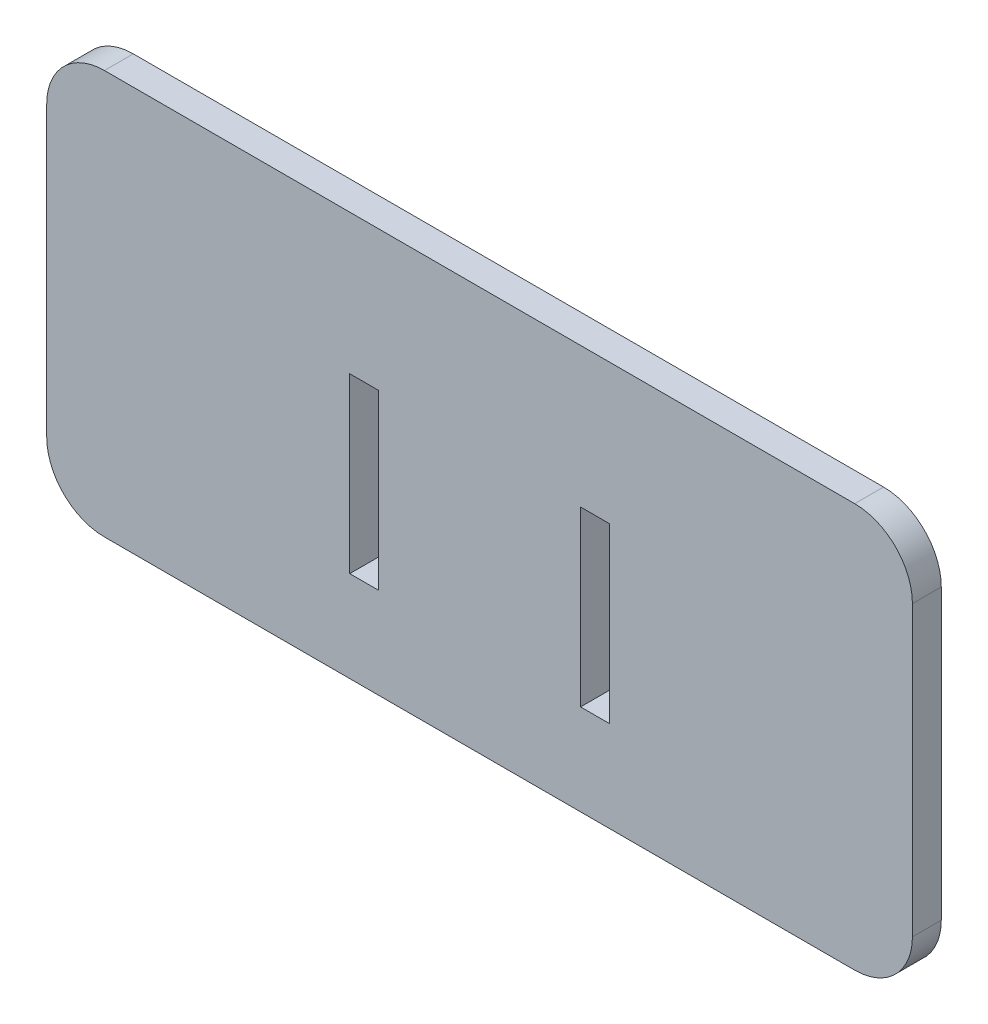
ISO-10303-21;
HEADER;
FILE_DESCRIPTION(('STEP AP214'),'2;1');
FILE_NAME('part.step','',(''),(''),'','','');
FILE_SCHEMA(('AUTOMOTIVE_DESIGN { 1 0 10303 214 1 1 1 1 }'));
ENDSEC;
DATA;
#1=APPLICATION_CONTEXT('core data for automotive mechanical design processes');
#2=APPLICATION_PROTOCOL_DEFINITION('international standard','automotive_design',2000,#1);
#3=PRODUCT_CONTEXT('',#1,'mechanical');
#4=PRODUCT('Part','Part','',(#3));
#5=PRODUCT_RELATED_PRODUCT_CATEGORY('part','',(#4));
#6=PRODUCT_DEFINITION_FORMATION('','',#4);
#7=PRODUCT_DEFINITION_CONTEXT('part definition',#1,'design');
#8=PRODUCT_DEFINITION('design','',#6,#7);
#9=PRODUCT_DEFINITION_SHAPE('','',#8);
#10=(LENGTH_UNIT() NAMED_UNIT(*) SI_UNIT(.MILLI.,.METRE.));
#11=(NAMED_UNIT(*) PLANE_ANGLE_UNIT() SI_UNIT($,.RADIAN.));
#12=(NAMED_UNIT(*) SI_UNIT($,.STERADIAN.) SOLID_ANGLE_UNIT());
#13=UNCERTAINTY_MEASURE_WITH_UNIT(LENGTH_MEASURE(1.E-05),#10,'distance_accuracy_value','');
#14=(GEOMETRIC_REPRESENTATION_CONTEXT(3) GLOBAL_UNCERTAINTY_ASSIGNED_CONTEXT((#13)) GLOBAL_UNIT_ASSIGNED_CONTEXT((#10,
#11,#12)) REPRESENTATION_CONTEXT('',''));
#15=CARTESIAN_POINT('',(0.,0.,0.));
#16=DIRECTION('',(0.,0.,1.));
#17=DIRECTION('',(1.,0.,0.));
#18=AXIS2_PLACEMENT_3D('',#15,#16,#17);
#19=CARTESIAN_POINT('',(80.,20.0000000000001,10.));
#20=DIRECTION('',(0.,0.,-1.));
#21=DIRECTION('',(-1.,0.,0.));
#22=AXIS2_PLACEMENT_3D('',#19,#20,#21);
#23=CYLINDRICAL_SURFACE('',#22,20.);
#24=CARTESIAN_POINT('',(80.,20.0000000000001,0.));
#25=DIRECTION('',(0.,0.,1.));
#26=DIRECTION('',(-1.,0.,0.));
#27=AXIS2_PLACEMENT_3D('',#24,#25,#26);
#28=CIRCLE('',#27,20.);
#29=CARTESIAN_POINT('',(100.,20.0000000000001,0.));
#30=VERTEX_POINT('',#29);
#31=CARTESIAN_POINT('',(80.,40.,0.));
#32=VERTEX_POINT('',#31);
#33=EDGE_CURVE('E199',#30,#32,#28,.T.);
#34=ORIENTED_EDGE('',*,*,#33,.T.);
#35=DIRECTION('',(0.,0.,-1.));
#36=VECTOR('',#35,1.);
#37=CARTESIAN_POINT('',(80.,40.,10.));
#38=LINE('',#37,#36);
#39=CARTESIAN_POINT('',(80.,40.,10.));
#40=VERTEX_POINT('',#39);
#41=EDGE_CURVE('E11',#40,#32,#38,.T.);
#42=ORIENTED_EDGE('',*,*,#41,.F.);
#43=CARTESIAN_POINT('',(80.,20.0000000000001,10.));
#44=DIRECTION('',(0.,0.,1.));
#45=DIRECTION('',(-1.,0.,0.));
#46=AXIS2_PLACEMENT_3D('',#43,#44,#45);
#47=CIRCLE('',#46,20.);
#48=CARTESIAN_POINT('',(100.,20.0000000000001,10.));
#49=VERTEX_POINT('',#48);
#50=EDGE_CURVE('E246',#49,#40,#47,.T.);
#51=ORIENTED_EDGE('',*,*,#50,.F.);
#52=DIRECTION('',(0.,0.,-1.));
#53=VECTOR('',#52,1.);
#54=CARTESIAN_POINT('',(100.,20.0000000000001,10.));
#55=LINE('',#54,#53);
#56=EDGE_CURVE('E272',#49,#30,#55,.T.);
#57=ORIENTED_EDGE('',*,*,#56,.T.);
#58=EDGE_LOOP('',(#34,#42,#51,#57));
#59=FACE_BOUND('',#58,.T.);
#60=ADVANCED_FACE('F39',(#59),#23,.T.);
#61=CARTESIAN_POINT('',(80.,40.,10.));
#62=DIRECTION('',(0.,-1.,0.));
#63=DIRECTION('',(1.,0.,0.));
#64=AXIS2_PLACEMENT_3D('',#61,#62,#63);
#65=PLANE('',#64);
#66=DIRECTION('',(-1.,0.,0.));
#67=VECTOR('',#66,1.);
#68=CARTESIAN_POINT('',(80.,40.,0.));
#69=LINE('',#68,#67);
#70=CARTESIAN_POINT('',(-180.,40.,0.));
#71=VERTEX_POINT('',#70);
#72=EDGE_CURVE('E276',#32,#71,#69,.T.);
#73=ORIENTED_EDGE('',*,*,#72,.T.);
#74=DIRECTION('',(0.,0.,-1.));
#75=VECTOR('',#74,1.);
#76=CARTESIAN_POINT('',(-180.,40.,10.));
#77=LINE('',#76,#75);
#78=CARTESIAN_POINT('',(-180.,40.,10.));
#79=VERTEX_POINT('',#78);
#80=EDGE_CURVE('E47',#79,#71,#77,.T.);
#81=ORIENTED_EDGE('',*,*,#80,.F.);
#82=DIRECTION('',(-1.,0.,0.));
#83=VECTOR('',#82,1.);
#84=CARTESIAN_POINT('',(80.,40.,10.));
#85=LINE('',#84,#83);
#86=EDGE_CURVE('E250',#40,#79,#85,.T.);
#87=ORIENTED_EDGE('',*,*,#86,.F.);
#88=ORIENTED_EDGE('',*,*,#41,.T.);
#89=EDGE_LOOP('',(#73,#81,#87,#88));
#90=FACE_BOUND('',#89,.T.);
#91=ADVANCED_FACE('F346',(#90),#65,.F.);
#92=CARTESIAN_POINT('',(-180.,20.,10.));
#93=DIRECTION('',(0.,0.,-1.));
#94=DIRECTION('',(-1.,0.,0.));
#95=AXIS2_PLACEMENT_3D('',#92,#93,#94);
#96=CYLINDRICAL_SURFACE('',#95,20.);
#97=CARTESIAN_POINT('',(-180.,20.,0.));
#98=DIRECTION('',(0.,0.,1.));
#99=DIRECTION('',(1.,0.,0.));
#100=AXIS2_PLACEMENT_3D('',#97,#98,#99);
#101=CIRCLE('',#100,20.);
#102=CARTESIAN_POINT('',(-200.,20.,0.));
#103=VERTEX_POINT('',#102);
#104=EDGE_CURVE('E279',#71,#103,#101,.T.);
#105=ORIENTED_EDGE('',*,*,#104,.T.);
#106=DIRECTION('',(0.,0.,-1.));
#107=VECTOR('',#106,1.);
#108=CARTESIAN_POINT('',(-200.,20.,10.));
#109=LINE('',#108,#107);
#110=CARTESIAN_POINT('',(-200.,20.,10.));
#111=VERTEX_POINT('',#110);
#112=EDGE_CURVE('E315',#111,#103,#109,.T.);
#113=ORIENTED_EDGE('',*,*,#112,.F.);
#114=CARTESIAN_POINT('',(-180.,20.,10.));
#115=DIRECTION('',(0.,0.,1.));
#116=DIRECTION('',(1.,0.,0.));
#117=AXIS2_PLACEMENT_3D('',#114,#115,#116);
#118=CIRCLE('',#117,20.);
#119=EDGE_CURVE('E254',#79,#111,#118,.T.);
#120=ORIENTED_EDGE('',*,*,#119,.F.);
#121=ORIENTED_EDGE('',*,*,#80,.T.);
#122=EDGE_LOOP('',(#105,#113,#120,#121));
#123=FACE_BOUND('',#122,.T.);
#124=ADVANCED_FACE('F324',(#123),#96,.T.);
#125=CARTESIAN_POINT('',(-200.,20.,10.));
#126=DIRECTION('',(1.,0.,0.));
#127=DIRECTION('',(0.,0.,-1.));
#128=AXIS2_PLACEMENT_3D('',#125,#126,#127);
#129=PLANE('',#128);
#130=DIRECTION('',(0.,-1.,0.));
#131=VECTOR('',#130,1.);
#132=CARTESIAN_POINT('',(-200.,20.,0.));
#133=LINE('',#132,#131);
#134=CARTESIAN_POINT('',(-200.,-79.9999999999999,0.));
#135=VERTEX_POINT('',#134);
#136=EDGE_CURVE('E282',#103,#135,#133,.T.);
#137=ORIENTED_EDGE('',*,*,#136,.T.);
#138=DIRECTION('',(0.,0.,-1.));
#139=VECTOR('',#138,1.);
#140=CARTESIAN_POINT('',(-200.,-79.9999999999999,10.));
#141=LINE('',#140,#139);
#142=CARTESIAN_POINT('',(-200.,-79.9999999999999,10.));
#143=VERTEX_POINT('',#142);
#144=EDGE_CURVE('E311',#143,#135,#141,.T.);
#145=ORIENTED_EDGE('',*,*,#144,.F.);
#146=DIRECTION('',(0.,-1.,0.));
#147=VECTOR('',#146,1.);
#148=CARTESIAN_POINT('',(-200.,20.,10.));
#149=LINE('',#148,#147);
#150=EDGE_CURVE('E257',#111,#143,#149,.T.);
#151=ORIENTED_EDGE('',*,*,#150,.F.);
#152=ORIENTED_EDGE('',*,*,#112,.T.);
#153=EDGE_LOOP('',(#137,#145,#151,#152));
#154=FACE_BOUND('',#153,.T.);
#155=ADVANCED_FACE('F334',(#154),#129,.F.);
#156=CARTESIAN_POINT('',(-180.,-80.,10.));
#157=DIRECTION('',(0.,0.,-1.));
#158=DIRECTION('',(-1.,0.,0.));
#159=AXIS2_PLACEMENT_3D('',#156,#157,#158);
#160=CYLINDRICAL_SURFACE('',#159,20.);
#161=CARTESIAN_POINT('',(-180.,-80.,0.));
#162=DIRECTION('',(0.,0.,1.));
#163=DIRECTION('',(-1.,0.,0.));
#164=AXIS2_PLACEMENT_3D('',#161,#162,#163);
#165=CIRCLE('',#164,20.);
#166=CARTESIAN_POINT('',(-180.,-100.,0.));
#167=VERTEX_POINT('',#166);
#168=EDGE_CURVE('E285',#135,#167,#165,.T.);
#169=ORIENTED_EDGE('',*,*,#168,.T.);
#170=DIRECTION('',(0.,0.,-1.));
#171=VECTOR('',#170,1.);
#172=CARTESIAN_POINT('',(-180.,-100.,10.));
#173=LINE('',#172,#171);
#174=CARTESIAN_POINT('',(-180.,-100.,10.));
#175=VERTEX_POINT('',#174);
#176=EDGE_CURVE('E307',#175,#167,#173,.T.);
#177=ORIENTED_EDGE('',*,*,#176,.F.);
#178=CARTESIAN_POINT('',(-180.,-80.,10.));
#179=DIRECTION('',(0.,0.,1.));
#180=DIRECTION('',(-1.,0.,0.));
#181=AXIS2_PLACEMENT_3D('',#178,#179,#180);
#182=CIRCLE('',#181,20.);
#183=EDGE_CURVE('E260',#143,#175,#182,.T.);
#184=ORIENTED_EDGE('',*,*,#183,.F.);
#185=ORIENTED_EDGE('',*,*,#144,.T.);
#186=EDGE_LOOP('',(#169,#177,#184,#185));
#187=FACE_BOUND('',#186,.T.);
#188=ADVANCED_FACE('F338',(#187),#160,.T.);
#189=CARTESIAN_POINT('',(80.,-100.,10.));
#190=DIRECTION('',(0.,1.,0.));
#191=DIRECTION('',(-1.,0.,0.));
#192=AXIS2_PLACEMENT_3D('',#189,#190,#191);
#193=PLANE('',#192);
#194=DIRECTION('',(1.,0.,0.));
#195=VECTOR('',#194,1.);
#196=CARTESIAN_POINT('',(80.,-100.,0.));
#197=LINE('',#196,#195);
#198=CARTESIAN_POINT('',(80.,-100.,0.));
#199=VERTEX_POINT('',#198);
#200=EDGE_CURVE('E288',#167,#199,#197,.T.);
#201=ORIENTED_EDGE('',*,*,#200,.T.);
#202=DIRECTION('',(0.,0.,-1.));
#203=VECTOR('',#202,1.);
#204=CARTESIAN_POINT('',(80.,-100.,10.));
#205=LINE('',#204,#203);
#206=CARTESIAN_POINT('',(80.,-100.,10.));
#207=VERTEX_POINT('',#206);
#208=EDGE_CURVE('E303',#207,#199,#205,.T.);
#209=ORIENTED_EDGE('',*,*,#208,.F.);
#210=DIRECTION('',(1.,0.,0.));
#211=VECTOR('',#210,1.);
#212=CARTESIAN_POINT('',(80.,-100.,10.));
#213=LINE('',#212,#211);
#214=EDGE_CURVE('E263',#175,#207,#213,.T.);
#215=ORIENTED_EDGE('',*,*,#214,.F.);
#216=ORIENTED_EDGE('',*,*,#176,.T.);
#217=EDGE_LOOP('',(#201,#209,#215,#216));
#218=FACE_BOUND('',#217,.T.);
#219=ADVANCED_FACE('F359',(#218),#193,.F.);
#220=CARTESIAN_POINT('',(80.,-80.,10.));
#221=DIRECTION('',(0.,0.,-1.));
#222=DIRECTION('',(-1.,0.,0.));
#223=AXIS2_PLACEMENT_3D('',#220,#221,#222);
#224=CYLINDRICAL_SURFACE('',#223,20.);
#225=CARTESIAN_POINT('',(80.,-80.,0.));
#226=DIRECTION('',(0.,0.,1.));
#227=DIRECTION('',(-1.,0.,0.));
#228=AXIS2_PLACEMENT_3D('',#225,#226,#227);
#229=CIRCLE('',#228,20.);
#230=CARTESIAN_POINT('',(100.,-80.,0.));
#231=VERTEX_POINT('',#230);
#232=EDGE_CURVE('E291',#199,#231,#229,.T.);
#233=ORIENTED_EDGE('',*,*,#232,.T.);
#234=DIRECTION('',(0.,0.,-1.));
#235=VECTOR('',#234,1.);
#236=CARTESIAN_POINT('',(100.,-80.,10.));
#237=LINE('',#236,#235);
#238=CARTESIAN_POINT('',(100.,-80.,10.));
#239=VERTEX_POINT('',#238);
#240=EDGE_CURVE('E299',#239,#231,#237,.T.);
#241=ORIENTED_EDGE('',*,*,#240,.F.);
#242=CARTESIAN_POINT('',(80.,-80.,10.));
#243=DIRECTION('',(0.,0.,1.));
#244=DIRECTION('',(-1.,0.,0.));
#245=AXIS2_PLACEMENT_3D('',#242,#243,#244);
#246=CIRCLE('',#245,20.);
#247=EDGE_CURVE('E266',#207,#239,#246,.T.);
#248=ORIENTED_EDGE('',*,*,#247,.F.);
#249=ORIENTED_EDGE('',*,*,#208,.T.);
#250=EDGE_LOOP('',(#233,#241,#248,#249));
#251=FACE_BOUND('',#250,.T.);
#252=ADVANCED_FACE('F357',(#251),#224,.T.);
#253=CARTESIAN_POINT('',(100.,20.0000000000001,10.));
#254=DIRECTION('',(-1.,0.,0.));
#255=DIRECTION('',(0.,-1.,0.));
#256=AXIS2_PLACEMENT_3D('',#253,#254,#255);
#257=PLANE('',#256);
#258=DIRECTION('',(0.,1.,0.));
#259=VECTOR('',#258,1.);
#260=CARTESIAN_POINT('',(100.,20.0000000000001,0.));
#261=LINE('',#260,#259);
#262=EDGE_CURVE('E251',#231,#30,#261,.T.);
#263=ORIENTED_EDGE('',*,*,#262,.T.);
#264=ORIENTED_EDGE('',*,*,#56,.F.);
#265=DIRECTION('',(0.,1.,0.));
#266=VECTOR('',#265,1.);
#267=CARTESIAN_POINT('',(100.,20.0000000000001,10.));
#268=LINE('',#267,#266);
#269=EDGE_CURVE('E269',#239,#49,#268,.T.);
#270=ORIENTED_EDGE('',*,*,#269,.F.);
#271=ORIENTED_EDGE('',*,*,#240,.T.);
#272=EDGE_LOOP('',(#263,#264,#270,#271));
#273=FACE_BOUND('',#272,.T.);
#274=ADVANCED_FACE('F352',(#273),#257,.F.);
#275=CARTESIAN_POINT('',(80.,20.0000000000001,10.));
#276=DIRECTION('',(0.,0.,-1.));
#277=DIRECTION('',(-1.,0.,0.));
#278=AXIS2_PLACEMENT_3D('',#275,#276,#277);
#279=PLANE('',#278);
#280=DIRECTION('',(-1.,0.,0.));
#281=VECTOR('',#280,1.);
#282=CARTESIAN_POINT('',(-94.9999999999998,-8.49999999999975,10.));
#283=LINE('',#282,#281);
#284=CARTESIAN_POINT('',(-84.9999999999998,-8.49999999999975,10.));
#285=VERTEX_POINT('',#284);
#286=CARTESIAN_POINT('',(-94.9999999999998,-8.49999999999975,10.));
#287=VERTEX_POINT('',#286);
#288=EDGE_CURVE('E189',#285,#287,#283,.T.);
#289=ORIENTED_EDGE('',*,*,#288,.F.);
#290=DIRECTION('',(0.,1.,0.));
#291=VECTOR('',#290,1.);
#292=CARTESIAN_POINT('',(-84.9999999999998,-68.4999999999998,10.));
#293=LINE('',#292,#291);
#294=CARTESIAN_POINT('',(-84.9999999999998,-68.4999999999998,10.));
#295=VERTEX_POINT('',#294);
#296=EDGE_CURVE('E54',#295,#285,#293,.T.);
#297=ORIENTED_EDGE('',*,*,#296,.F.);
#298=DIRECTION('',(1.,0.,0.));
#299=VECTOR('',#298,1.);
#300=CARTESIAN_POINT('',(-94.9999999999998,-68.4999999999998,10.));
#301=LINE('',#300,#299);
#302=CARTESIAN_POINT('',(-94.9999999999998,-68.4999999999998,10.));
#303=VERTEX_POINT('',#302);
#304=EDGE_CURVE('E176',#303,#295,#301,.T.);
#305=ORIENTED_EDGE('',*,*,#304,.F.);
#306=DIRECTION('',(0.,-1.,0.));
#307=VECTOR('',#306,1.);
#308=CARTESIAN_POINT('',(-94.9999999999998,-68.4999999999998,10.));
#309=LINE('',#308,#307);
#310=EDGE_CURVE('E180',#287,#303,#309,.T.);
#311=ORIENTED_EDGE('',*,*,#310,.F.);
#312=EDGE_LOOP('',(#289,#297,#305,#311));
#313=FACE_BOUND('',#312,.T.);
#314=DIRECTION('',(-1.,0.,0.));
#315=VECTOR('',#314,1.);
#316=CARTESIAN_POINT('',(-14.9999999999998,-8.50000000000028,10.));
#317=LINE('',#316,#315);
#318=CARTESIAN_POINT('',(-4.99999999999981,-8.50000000000028,10.));
#319=VERTEX_POINT('',#318);
#320=CARTESIAN_POINT('',(-14.9999999999998,-8.50000000000028,10.));
#321=VERTEX_POINT('',#320);
#322=EDGE_CURVE('E225',#319,#321,#317,.T.);
#323=ORIENTED_EDGE('',*,*,#322,.F.);
#324=DIRECTION('',(0.,1.,0.));
#325=VECTOR('',#324,1.);
#326=CARTESIAN_POINT('',(-4.99999999999981,-68.5000000000003,10.));
#327=LINE('',#326,#325);
#328=CARTESIAN_POINT('',(-4.99999999999981,-68.5000000000003,10.));
#329=VERTEX_POINT('',#328);
#330=EDGE_CURVE('E62',#329,#319,#327,.T.);
#331=ORIENTED_EDGE('',*,*,#330,.F.);
#332=DIRECTION('',(1.,0.,0.));
#333=VECTOR('',#332,1.);
#334=CARTESIAN_POINT('',(-14.9999999999998,-68.5000000000003,10.));
#335=LINE('',#334,#333);
#336=CARTESIAN_POINT('',(-14.9999999999998,-68.5000000000003,10.));
#337=VERTEX_POINT('',#336);
#338=EDGE_CURVE('E210',#337,#329,#335,.T.);
#339=ORIENTED_EDGE('',*,*,#338,.F.);
#340=DIRECTION('',(0.,-1.,0.));
#341=VECTOR('',#340,1.);
#342=CARTESIAN_POINT('',(-14.9999999999998,-68.5000000000003,10.));
#343=LINE('',#342,#341);
#344=EDGE_CURVE('E229',#321,#337,#343,.T.);
#345=ORIENTED_EDGE('',*,*,#344,.F.);
#346=EDGE_LOOP('',(#323,#331,#339,#345));
#347=FACE_BOUND('',#346,.T.);
#348=ORIENTED_EDGE('',*,*,#50,.T.);
#349=ORIENTED_EDGE('',*,*,#86,.T.);
#350=ORIENTED_EDGE('',*,*,#119,.T.);
#351=ORIENTED_EDGE('',*,*,#150,.T.);
#352=ORIENTED_EDGE('',*,*,#183,.T.);
#353=ORIENTED_EDGE('',*,*,#214,.T.);
#354=ORIENTED_EDGE('',*,*,#247,.T.);
#355=ORIENTED_EDGE('',*,*,#269,.T.);
#356=EDGE_LOOP('',(#348,#349,#350,#351,#352,#353,#354,#355));
#357=FACE_BOUND('',#356,.T.);
#358=ADVANCED_FACE('F342',(#313,#347,#357),#279,.F.);
#359=CARTESIAN_POINT('',(80.,20.0000000000001,0.));
#360=DIRECTION('',(0.,0.,-1.));
#361=DIRECTION('',(-1.,0.,0.));
#362=AXIS2_PLACEMENT_3D('',#359,#360,#361);
#363=PLANE('',#362);
#364=DIRECTION('',(0.,1.,0.));
#365=VECTOR('',#364,1.);
#366=CARTESIAN_POINT('',(-84.9999999999998,-68.4999999999998,0.));
#367=LINE('',#366,#365);
#368=CARTESIAN_POINT('',(-84.9999999999998,-68.4999999999998,0.));
#369=VERTEX_POINT('',#368);
#370=CARTESIAN_POINT('',(-84.9999999999998,-8.49999999999975,0.));
#371=VERTEX_POINT('',#370);
#372=EDGE_CURVE('E154',#369,#371,#367,.T.);
#373=ORIENTED_EDGE('',*,*,#372,.T.);
#374=DIRECTION('',(-1.,0.,0.));
#375=VECTOR('',#374,1.);
#376=CARTESIAN_POINT('',(-94.9999999999998,-8.49999999999975,0.));
#377=LINE('',#376,#375);
#378=CARTESIAN_POINT('',(-94.9999999999998,-8.49999999999975,0.));
#379=VERTEX_POINT('',#378);
#380=EDGE_CURVE('E165',#371,#379,#377,.T.);
#381=ORIENTED_EDGE('',*,*,#380,.T.);
#382=DIRECTION('',(0.,-1.,0.));
#383=VECTOR('',#382,1.);
#384=CARTESIAN_POINT('',(-94.9999999999998,-68.4999999999998,0.));
#385=LINE('',#384,#383);
#386=CARTESIAN_POINT('',(-94.9999999999998,-68.4999999999998,0.));
#387=VERTEX_POINT('',#386);
#388=EDGE_CURVE('E170',#379,#387,#385,.T.);
#389=ORIENTED_EDGE('',*,*,#388,.T.);
#390=DIRECTION('',(1.,0.,0.));
#391=VECTOR('',#390,1.);
#392=CARTESIAN_POINT('',(-94.9999999999998,-68.4999999999998,0.));
#393=LINE('',#392,#391);
#394=EDGE_CURVE('E161',#387,#369,#393,.T.);
#395=ORIENTED_EDGE('',*,*,#394,.T.);
#396=EDGE_LOOP('',(#373,#381,#389,#395));
#397=FACE_BOUND('',#396,.T.);
#398=DIRECTION('',(0.,1.,0.));
#399=VECTOR('',#398,1.);
#400=CARTESIAN_POINT('',(-4.99999999999981,-68.5000000000003,0.));
#401=LINE('',#400,#399);
#402=CARTESIAN_POINT('',(-4.99999999999981,-68.5000000000003,0.));
#403=VERTEX_POINT('',#402);
#404=CARTESIAN_POINT('',(-4.99999999999981,-8.50000000000028,0.));
#405=VERTEX_POINT('',#404);
#406=EDGE_CURVE('E205',#403,#405,#401,.T.);
#407=ORIENTED_EDGE('',*,*,#406,.T.);
#408=DIRECTION('',(-1.,0.,0.));
#409=VECTOR('',#408,1.);
#410=CARTESIAN_POINT('',(-14.9999999999998,-8.50000000000028,0.));
#411=LINE('',#410,#409);
#412=CARTESIAN_POINT('',(-14.9999999999998,-8.50000000000028,0.));
#413=VERTEX_POINT('',#412);
#414=EDGE_CURVE('E209',#405,#413,#411,.T.);
#415=ORIENTED_EDGE('',*,*,#414,.T.);
#416=DIRECTION('',(0.,-1.,0.));
#417=VECTOR('',#416,1.);
#418=CARTESIAN_POINT('',(-14.9999999999998,-68.5000000000003,0.));
#419=LINE('',#418,#417);
#420=CARTESIAN_POINT('',(-14.9999999999998,-68.5000000000003,0.));
#421=VERTEX_POINT('',#420);
#422=EDGE_CURVE('E214',#413,#421,#419,.T.);
#423=ORIENTED_EDGE('',*,*,#422,.T.);
#424=DIRECTION('',(1.,0.,0.));
#425=VECTOR('',#424,1.);
#426=CARTESIAN_POINT('',(-14.9999999999998,-68.5000000000003,0.));
#427=LINE('',#426,#425);
#428=EDGE_CURVE('E218',#421,#403,#427,.T.);
#429=ORIENTED_EDGE('',*,*,#428,.T.);
#430=EDGE_LOOP('',(#407,#415,#423,#429));
#431=FACE_BOUND('',#430,.T.);
#432=ORIENTED_EDGE('',*,*,#33,.F.);
#433=ORIENTED_EDGE('',*,*,#262,.F.);
#434=ORIENTED_EDGE('',*,*,#232,.F.);
#435=ORIENTED_EDGE('',*,*,#200,.F.);
#436=ORIENTED_EDGE('',*,*,#168,.F.);
#437=ORIENTED_EDGE('',*,*,#136,.F.);
#438=ORIENTED_EDGE('',*,*,#104,.F.);
#439=ORIENTED_EDGE('',*,*,#72,.F.);
#440=EDGE_LOOP('',(#432,#433,#434,#435,#436,#437,#438,#439));
#441=FACE_BOUND('',#440,.T.);
#442=ADVANCED_FACE('F172',(#397,#431,#441),#363,.T.);
#443=CARTESIAN_POINT('',(-4.99999999999981,-68.5000000000003,0.));
#444=DIRECTION('',(1.,0.,0.));
#445=DIRECTION('',(0.,0.,-1.));
#446=AXIS2_PLACEMENT_3D('',#443,#444,#445);
#447=PLANE('',#446);
#448=ORIENTED_EDGE('',*,*,#330,.T.);
#449=DIRECTION('',(0.,0.,1.));
#450=VECTOR('',#449,1.);
#451=CARTESIAN_POINT('',(-4.99999999999981,-8.50000000000028,0.));
#452=LINE('',#451,#450);
#453=EDGE_CURVE('E222',#405,#319,#452,.T.);
#454=ORIENTED_EDGE('',*,*,#453,.F.);
#455=ORIENTED_EDGE('',*,*,#406,.F.);
#456=DIRECTION('',(0.,0.,1.));
#457=VECTOR('',#456,1.);
#458=CARTESIAN_POINT('',(-4.99999999999981,-68.5000000000003,0.));
#459=LINE('',#458,#457);
#460=EDGE_CURVE('E190',#403,#329,#459,.T.);
#461=ORIENTED_EDGE('',*,*,#460,.T.);
#462=EDGE_LOOP('',(#448,#454,#455,#461));
#463=FACE_BOUND('',#462,.T.);
#464=ADVANCED_FACE('F422',(#463),#447,.F.);
#465=CARTESIAN_POINT('',(-14.9999999999998,-68.5000000000003,0.));
#466=DIRECTION('',(0.,-1.,0.));
#467=DIRECTION('',(0.,0.,-1.));
#468=AXIS2_PLACEMENT_3D('',#465,#466,#467);
#469=PLANE('',#468);
#470=ORIENTED_EDGE('',*,*,#338,.T.);
#471=ORIENTED_EDGE('',*,*,#460,.F.);
#472=ORIENTED_EDGE('',*,*,#428,.F.);
#473=DIRECTION('',(0.,0.,1.));
#474=VECTOR('',#473,1.);
#475=CARTESIAN_POINT('',(-14.9999999999998,-68.5000000000003,0.));
#476=LINE('',#475,#474);
#477=EDGE_CURVE('E238',#421,#337,#476,.T.);
#478=ORIENTED_EDGE('',*,*,#477,.T.);
#479=EDGE_LOOP('',(#470,#471,#472,#478));
#480=FACE_BOUND('',#479,.T.);
#481=ADVANCED_FACE('F431',(#480),#469,.F.);
#482=CARTESIAN_POINT('',(-14.9999999999998,-68.5000000000003,0.));
#483=DIRECTION('',(-1.,0.,0.));
#484=DIRECTION('',(0.,0.,1.));
#485=AXIS2_PLACEMENT_3D('',#482,#483,#484);
#486=PLANE('',#485);
#487=ORIENTED_EDGE('',*,*,#344,.T.);
#488=ORIENTED_EDGE('',*,*,#477,.F.);
#489=ORIENTED_EDGE('',*,*,#422,.F.);
#490=DIRECTION('',(0.,0.,1.));
#491=VECTOR('',#490,1.);
#492=CARTESIAN_POINT('',(-14.9999999999998,-8.50000000000028,0.));
#493=LINE('',#492,#491);
#494=EDGE_CURVE('E241',#413,#321,#493,.T.);
#495=ORIENTED_EDGE('',*,*,#494,.T.);
#496=EDGE_LOOP('',(#487,#488,#489,#495));
#497=FACE_BOUND('',#496,.T.);
#498=ADVANCED_FACE('F440',(#497),#486,.F.);
#499=CARTESIAN_POINT('',(-14.9999999999998,-8.50000000000028,0.));
#500=DIRECTION('',(0.,1.,0.));
#501=DIRECTION('',(0.,0.,1.));
#502=AXIS2_PLACEMENT_3D('',#499,#500,#501);
#503=PLANE('',#502);
#504=ORIENTED_EDGE('',*,*,#322,.T.);
#505=ORIENTED_EDGE('',*,*,#494,.F.);
#506=ORIENTED_EDGE('',*,*,#414,.F.);
#507=ORIENTED_EDGE('',*,*,#453,.T.);
#508=EDGE_LOOP('',(#504,#505,#506,#507));
#509=FACE_BOUND('',#508,.T.);
#510=ADVANCED_FACE('F450',(#509),#503,.F.);
#511=CARTESIAN_POINT('',(-84.9999999999998,-68.4999999999998,0.));
#512=DIRECTION('',(1.,0.,0.));
#513=DIRECTION('',(0.,0.,-1.));
#514=AXIS2_PLACEMENT_3D('',#511,#512,#513);
#515=PLANE('',#514);
#516=ORIENTED_EDGE('',*,*,#296,.T.);
#517=DIRECTION('',(0.,0.,1.));
#518=VECTOR('',#517,1.);
#519=CARTESIAN_POINT('',(-84.9999999999998,-8.49999999999975,0.));
#520=LINE('',#519,#518);
#521=EDGE_CURVE('E150',#371,#285,#520,.T.);
#522=ORIENTED_EDGE('',*,*,#521,.F.);
#523=ORIENTED_EDGE('',*,*,#372,.F.);
#524=DIRECTION('',(0.,0.,1.));
#525=VECTOR('',#524,1.);
#526=CARTESIAN_POINT('',(-84.9999999999998,-68.4999999999998,0.));
#527=LINE('',#526,#525);
#528=EDGE_CURVE('E196',#369,#295,#527,.T.);
#529=ORIENTED_EDGE('',*,*,#528,.T.);
#530=EDGE_LOOP('',(#516,#522,#523,#529));
#531=FACE_BOUND('',#530,.T.);
#532=ADVANCED_FACE('F152',(#531),#515,.F.);
#533=CARTESIAN_POINT('',(-94.9999999999998,-68.4999999999998,0.));
#534=DIRECTION('',(0.,-1.,0.));
#535=DIRECTION('',(0.,0.,-1.));
#536=AXIS2_PLACEMENT_3D('',#533,#534,#535);
#537=PLANE('',#536);
#538=ORIENTED_EDGE('',*,*,#304,.T.);
#539=ORIENTED_EDGE('',*,*,#528,.F.);
#540=ORIENTED_EDGE('',*,*,#394,.F.);
#541=DIRECTION('',(0.,0.,1.));
#542=VECTOR('',#541,1.);
#543=CARTESIAN_POINT('',(-94.9999999999998,-68.4999999999998,0.));
#544=LINE('',#543,#542);
#545=EDGE_CURVE('E200',#387,#303,#544,.T.);
#546=ORIENTED_EDGE('',*,*,#545,.T.);
#547=EDGE_LOOP('',(#538,#539,#540,#546));
#548=FACE_BOUND('',#547,.T.);
#549=ADVANCED_FACE('F469',(#548),#537,.F.);
#550=CARTESIAN_POINT('',(-94.9999999999998,-68.4999999999998,0.));
#551=DIRECTION('',(-1.,0.,0.));
#552=DIRECTION('',(0.,0.,1.));
#553=AXIS2_PLACEMENT_3D('',#550,#551,#552);
#554=PLANE('',#553);
#555=ORIENTED_EDGE('',*,*,#310,.T.);
#556=ORIENTED_EDGE('',*,*,#545,.F.);
#557=ORIENTED_EDGE('',*,*,#388,.F.);
#558=DIRECTION('',(0.,0.,1.));
#559=VECTOR('',#558,1.);
#560=CARTESIAN_POINT('',(-94.9999999999998,-8.49999999999975,0.));
#561=LINE('',#560,#559);
#562=EDGE_CURVE('E160',#379,#287,#561,.T.);
#563=ORIENTED_EDGE('',*,*,#562,.T.);
#564=EDGE_LOOP('',(#555,#556,#557,#563));
#565=FACE_BOUND('',#564,.T.);
#566=ADVANCED_FACE('F478',(#565),#554,.F.);
#567=CARTESIAN_POINT('',(-94.9999999999998,-8.49999999999975,0.));
#568=DIRECTION('',(0.,1.,0.));
#569=DIRECTION('',(0.,0.,1.));
#570=AXIS2_PLACEMENT_3D('',#567,#568,#569);
#571=PLANE('',#570);
#572=ORIENTED_EDGE('',*,*,#288,.T.);
#573=ORIENTED_EDGE('',*,*,#562,.F.);
#574=ORIENTED_EDGE('',*,*,#380,.F.);
#575=ORIENTED_EDGE('',*,*,#521,.T.);
#576=EDGE_LOOP('',(#572,#573,#574,#575));
#577=FACE_BOUND('',#576,.T.);
#578=ADVANCED_FACE('F166',(#577),#571,.F.);
#579=CLOSED_SHELL('',(#60,#91,#124,#155,#188,#219,#252,#274,#358,#442,#464,#481,#498,#510,#532,
#549,#566,#578));
#580=MANIFOLD_SOLID_BREP('B2',#579);
#581=ADVANCED_BREP_SHAPE_REPRESENTATION('',(#18,#580),#14);
#582=SHAPE_DEFINITION_REPRESENTATION(#9,#581);
ENDSEC;
END-ISO-10303-21;
